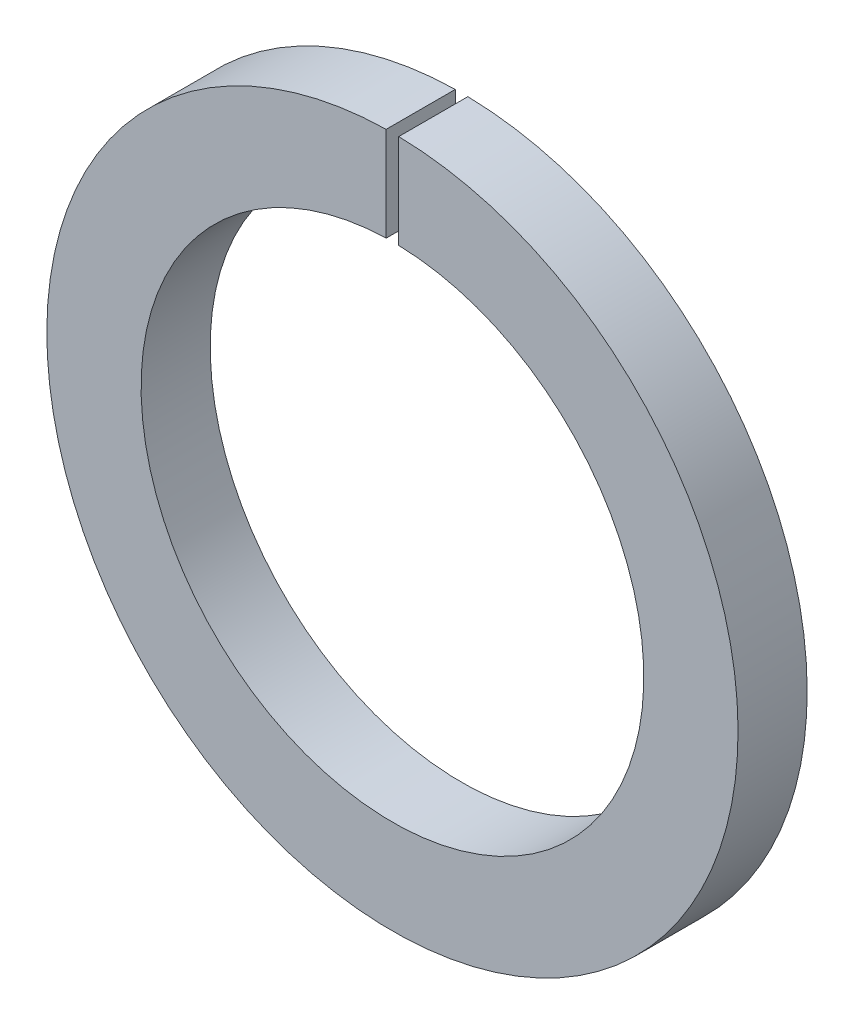
ISO-10303-21;
HEADER;
FILE_DESCRIPTION(('STEP AP214'),'2;1');
FILE_NAME('part.step','',(''),(''),'','','');
FILE_SCHEMA(('AUTOMOTIVE_DESIGN { 1 0 10303 214 1 1 1 1 }'));
ENDSEC;
DATA;
#1=APPLICATION_CONTEXT('core data for automotive mechanical design processes');
#2=APPLICATION_PROTOCOL_DEFINITION('international standard','automotive_design',2000,#1);
#3=PRODUCT_CONTEXT('',#1,'mechanical');
#4=PRODUCT('Part','Part','',(#3));
#5=PRODUCT_RELATED_PRODUCT_CATEGORY('part','',(#4));
#6=PRODUCT_DEFINITION_FORMATION('','',#4);
#7=PRODUCT_DEFINITION_CONTEXT('part definition',#1,'design');
#8=PRODUCT_DEFINITION('design','',#6,#7);
#9=PRODUCT_DEFINITION_SHAPE('','',#8);
#10=(LENGTH_UNIT() NAMED_UNIT(*) SI_UNIT(.MILLI.,.METRE.));
#11=(NAMED_UNIT(*) PLANE_ANGLE_UNIT() SI_UNIT($,.RADIAN.));
#12=(NAMED_UNIT(*) SI_UNIT($,.STERADIAN.) SOLID_ANGLE_UNIT());
#13=UNCERTAINTY_MEASURE_WITH_UNIT(LENGTH_MEASURE(1.E-05),#10,'distance_accuracy_value','');
#14=(GEOMETRIC_REPRESENTATION_CONTEXT(3) GLOBAL_UNCERTAINTY_ASSIGNED_CONTEXT((#13)) GLOBAL_UNIT_ASSIGNED_CONTEXT((#10,
#11,#12)) REPRESENTATION_CONTEXT('',''));
#15=CARTESIAN_POINT('',(0.,0.,0.));
#16=DIRECTION('',(0.,0.,1.));
#17=DIRECTION('',(1.,0.,0.));
#18=AXIS2_PLACEMENT_3D('',#15,#16,#17);
#19=CARTESIAN_POINT('',(15.0572369308232,12.6907672161525,10.2));
#20=DIRECTION('',(0.,0.,-1.));
#21=DIRECTION('',(-1.,0.,0.));
#22=AXIS2_PLACEMENT_3D('',#19,#20,#21);
#23=CYLINDRICAL_SURFACE('',#22,4.);
#24=CARTESIAN_POINT('',(15.0572369308232,12.6907672161525,10.2));
#25=DIRECTION('',(0.,0.,1.));
#26=DIRECTION('',(1.,0.,0.));
#27=AXIS2_PLACEMENT_3D('',#24,#25,#26);
#28=CIRCLE('',#27,4.);
#29=CARTESIAN_POINT('',(14.9572369308232,16.689517020779,10.2));
#30=VERTEX_POINT('',#29);
#31=CARTESIAN_POINT('',(15.1572369308232,16.689517020779,10.2));
#32=VERTEX_POINT('',#31);
#33=EDGE_CURVE('E11',#30,#32,#28,.T.);
#34=ORIENTED_EDGE('',*,*,#33,.T.);
#35=DIRECTION('',(0.,0.,1.));
#36=VECTOR('',#35,1.);
#37=CARTESIAN_POINT('',(15.1572369308232,16.689517020779,10.2));
#38=LINE('',#37,#36);
#39=CARTESIAN_POINT('',(15.1572369308232,16.689517020779,9.1));
#40=VERTEX_POINT('',#39);
#41=EDGE_CURVE('E21',#40,#32,#38,.T.);
#42=ORIENTED_EDGE('',*,*,#41,.F.);
#43=CARTESIAN_POINT('',(15.0572369308232,12.6907672161525,9.1));
#44=DIRECTION('',(0.,0.,1.));
#45=DIRECTION('',(1.,0.,0.));
#46=AXIS2_PLACEMENT_3D('',#43,#44,#45);
#47=CIRCLE('',#46,4.);
#48=CARTESIAN_POINT('',(14.9572369308232,16.689517020779,9.1));
#49=VERTEX_POINT('',#48);
#50=EDGE_CURVE('E36',#49,#40,#47,.T.);
#51=ORIENTED_EDGE('',*,*,#50,.F.);
#52=DIRECTION('',(0.,0.,-1.));
#53=VECTOR('',#52,1.);
#54=CARTESIAN_POINT('',(14.9572369308232,16.689517020779,10.2));
#55=LINE('',#54,#53);
#56=EDGE_CURVE('E77',#30,#49,#55,.T.);
#57=ORIENTED_EDGE('',*,*,#56,.F.);
#58=EDGE_LOOP('',(#34,#42,#51,#57));
#59=FACE_BOUND('',#58,.T.);
#60=ADVANCED_FACE('F17',(#59),#23,.F.);
#61=CARTESIAN_POINT('',(15.0572369308232,12.6907672161525,10.2));
#62=DIRECTION('',(0.,0.,-1.));
#63=DIRECTION('',(-1.,0.,0.));
#64=AXIS2_PLACEMENT_3D('',#61,#62,#63);
#65=CYLINDRICAL_SURFACE('',#64,5.5);
#66=CARTESIAN_POINT('',(15.0572369308232,12.6907672161525,10.2));
#67=DIRECTION('',(0.,0.,1.));
#68=DIRECTION('',(1.,0.,0.));
#69=AXIS2_PLACEMENT_3D('',#66,#67,#68);
#70=CIRCLE('',#69,5.5);
#71=CARTESIAN_POINT('',(14.9572369308232,18.1898580500995,10.2));
#72=VERTEX_POINT('',#71);
#73=CARTESIAN_POINT('',(15.1572369308232,18.1898580500995,10.2));
#74=VERTEX_POINT('',#73);
#75=EDGE_CURVE('E81',#72,#74,#70,.T.);
#76=ORIENTED_EDGE('',*,*,#75,.F.);
#77=DIRECTION('',(0.,0.,-1.));
#78=VECTOR('',#77,1.);
#79=CARTESIAN_POINT('',(14.9572369308232,18.1898580500995,10.2));
#80=LINE('',#79,#78);
#81=CARTESIAN_POINT('',(14.9572369308232,18.1898580500995,9.1));
#82=VERTEX_POINT('',#81);
#83=EDGE_CURVE('E69',#72,#82,#80,.T.);
#84=ORIENTED_EDGE('',*,*,#83,.T.);
#85=CARTESIAN_POINT('',(15.0572369308232,12.6907672161525,9.1));
#86=DIRECTION('',(0.,0.,1.));
#87=DIRECTION('',(1.,0.,0.));
#88=AXIS2_PLACEMENT_3D('',#85,#86,#87);
#89=CIRCLE('',#88,5.5);
#90=CARTESIAN_POINT('',(15.1572369308232,18.1898580500995,9.1));
#91=VERTEX_POINT('',#90);
#92=EDGE_CURVE('E27',#82,#91,#89,.T.);
#93=ORIENTED_EDGE('',*,*,#92,.T.);
#94=DIRECTION('',(0.,0.,1.));
#95=VECTOR('',#94,1.);
#96=CARTESIAN_POINT('',(15.1572369308232,18.1898580500995,10.2));
#97=LINE('',#96,#95);
#98=EDGE_CURVE('E68',#91,#74,#97,.T.);
#99=ORIENTED_EDGE('',*,*,#98,.T.);
#100=EDGE_LOOP('',(#76,#84,#93,#99));
#101=FACE_BOUND('',#100,.T.);
#102=ADVANCED_FACE('F88',(#101),#65,.T.);
#103=CARTESIAN_POINT('',(15.0572369308232,12.6907672161525,10.2));
#104=DIRECTION('',(0.,0.,1.));
#105=DIRECTION('',(1.,0.,0.));
#106=AXIS2_PLACEMENT_3D('',#103,#104,#105);
#107=PLANE('',#106);
#108=DIRECTION('',(0.,-1.,0.));
#109=VECTOR('',#108,1.);
#110=CARTESIAN_POINT('',(14.9572369308232,18.5267922423031,10.2));
#111=LINE('',#110,#109);
#112=EDGE_CURVE('E74',#72,#30,#111,.T.);
#113=ORIENTED_EDGE('',*,*,#112,.F.);
#114=ORIENTED_EDGE('',*,*,#75,.T.);
#115=DIRECTION('',(0.,1.,0.));
#116=VECTOR('',#115,1.);
#117=CARTESIAN_POINT('',(15.1572369308232,18.5267922423031,10.2));
#118=LINE('',#117,#116);
#119=EDGE_CURVE('E72',#32,#74,#118,.T.);
#120=ORIENTED_EDGE('',*,*,#119,.F.);
#121=ORIENTED_EDGE('',*,*,#33,.F.);
#122=EDGE_LOOP('',(#113,#114,#120,#121));
#123=FACE_BOUND('',#122,.T.);
#124=ADVANCED_FACE('F91',(#123),#107,.T.);
#125=CARTESIAN_POINT('',(15.0572369308232,12.6907672161525,9.1));
#126=DIRECTION('',(0.,0.,1.));
#127=DIRECTION('',(1.,0.,0.));
#128=AXIS2_PLACEMENT_3D('',#125,#126,#127);
#129=PLANE('',#128);
#130=ORIENTED_EDGE('',*,*,#92,.F.);
#131=DIRECTION('',(0.,-1.,0.));
#132=VECTOR('',#131,1.);
#133=CARTESIAN_POINT('',(14.9572369308232,18.5267922423031,9.1));
#134=LINE('',#133,#132);
#135=EDGE_CURVE('E61',#82,#49,#134,.T.);
#136=ORIENTED_EDGE('',*,*,#135,.T.);
#137=ORIENTED_EDGE('',*,*,#50,.T.);
#138=DIRECTION('',(0.,1.,0.));
#139=VECTOR('',#138,1.);
#140=CARTESIAN_POINT('',(15.1572369308232,18.5267922423031,9.1));
#141=LINE('',#140,#139);
#142=EDGE_CURVE('E60',#40,#91,#141,.T.);
#143=ORIENTED_EDGE('',*,*,#142,.T.);
#144=EDGE_LOOP('',(#130,#136,#137,#143));
#145=FACE_BOUND('',#144,.T.);
#146=ADVANCED_FACE('F59',(#145),#129,.F.);
#147=CARTESIAN_POINT('',(15.1572369308232,18.5267922423031,9.1));
#148=DIRECTION('',(1.,0.,0.));
#149=DIRECTION('',(0.,1.,0.));
#150=AXIS2_PLACEMENT_3D('',#147,#148,#149);
#151=PLANE('',#150);
#152=ORIENTED_EDGE('',*,*,#142,.F.);
#153=ORIENTED_EDGE('',*,*,#41,.T.);
#154=ORIENTED_EDGE('',*,*,#119,.T.);
#155=ORIENTED_EDGE('',*,*,#98,.F.);
#156=EDGE_LOOP('',(#152,#153,#154,#155));
#157=FACE_BOUND('',#156,.T.);
#158=ADVANCED_FACE('F65',(#157),#151,.F.);
#159=CARTESIAN_POINT('',(14.9572369308232,18.5267922423031,9.1));
#160=DIRECTION('',(-1.,0.,0.));
#161=DIRECTION('',(0.,-1.,0.));
#162=AXIS2_PLACEMENT_3D('',#159,#160,#161);
#163=PLANE('',#162);
#164=ORIENTED_EDGE('',*,*,#112,.T.);
#165=ORIENTED_EDGE('',*,*,#56,.T.);
#166=ORIENTED_EDGE('',*,*,#135,.F.);
#167=ORIENTED_EDGE('',*,*,#83,.F.);
#168=EDGE_LOOP('',(#164,#165,#166,#167));
#169=FACE_BOUND('',#168,.T.);
#170=ADVANCED_FACE('F19',(#169),#163,.F.);
#171=CLOSED_SHELL('',(#60,#102,#124,#146,#158,#170));
#172=MANIFOLD_SOLID_BREP('B1',#171);
#173=ADVANCED_BREP_SHAPE_REPRESENTATION('',(#18,#172),#14);
#174=SHAPE_DEFINITION_REPRESENTATION(#9,#173);
ENDSEC;
END-ISO-10303-21;
